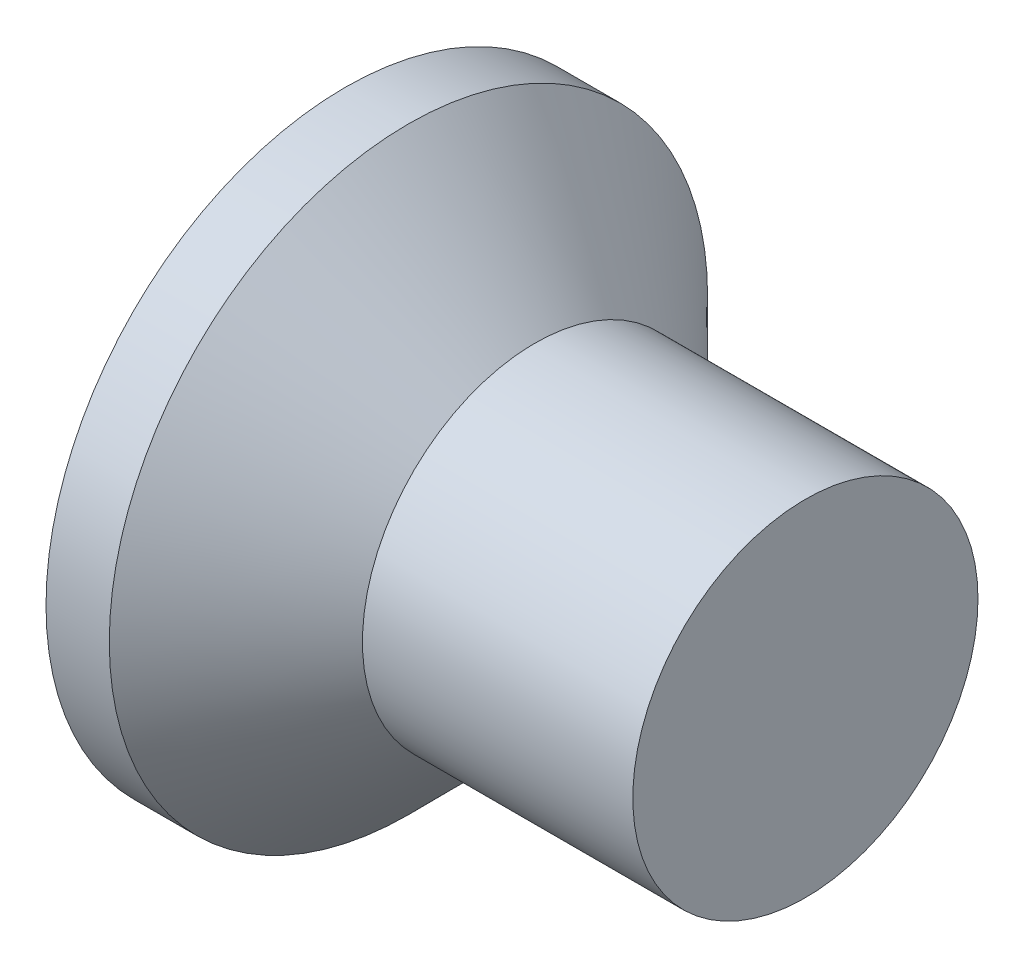
ISO-10303-21;
HEADER;
FILE_DESCRIPTION(('STEP AP214'),'2;1');
FILE_NAME('part.step','',(''),(''),'','','');
FILE_SCHEMA(('AUTOMOTIVE_DESIGN { 1 0 10303 214 1 1 1 1 }'));
ENDSEC;
DATA;
#1=APPLICATION_CONTEXT('core data for automotive mechanical design processes');
#2=APPLICATION_PROTOCOL_DEFINITION('international standard','automotive_design',2000,#1);
#3=PRODUCT_CONTEXT('',#1,'mechanical');
#4=PRODUCT('Part','Part','',(#3));
#5=PRODUCT_RELATED_PRODUCT_CATEGORY('part','',(#4));
#6=PRODUCT_DEFINITION_FORMATION('','',#4);
#7=PRODUCT_DEFINITION_CONTEXT('part definition',#1,'design');
#8=PRODUCT_DEFINITION('design','',#6,#7);
#9=PRODUCT_DEFINITION_SHAPE('','',#8);
#10=(LENGTH_UNIT() NAMED_UNIT(*) SI_UNIT(.MILLI.,.METRE.));
#11=(NAMED_UNIT(*) PLANE_ANGLE_UNIT() SI_UNIT($,.RADIAN.));
#12=(NAMED_UNIT(*) SI_UNIT($,.STERADIAN.) SOLID_ANGLE_UNIT());
#13=UNCERTAINTY_MEASURE_WITH_UNIT(LENGTH_MEASURE(1.E-05),#10,'distance_accuracy_value','');
#14=(GEOMETRIC_REPRESENTATION_CONTEXT(3) GLOBAL_UNCERTAINTY_ASSIGNED_CONTEXT((#13)) GLOBAL_UNIT_ASSIGNED_CONTEXT((#10,
#11,#12)) REPRESENTATION_CONTEXT('',''));
#15=CARTESIAN_POINT('',(0.,0.,0.));
#16=DIRECTION('',(0.,0.,1.));
#17=DIRECTION('',(1.,0.,0.));
#18=AXIS2_PLACEMENT_3D('',#15,#16,#17);
#19=CARTESIAN_POINT('',(0.,2.6,0.));
#20=DIRECTION('',(-1.,0.,0.));
#21=DIRECTION('',(0.,0.,1.));
#22=AXIS2_PLACEMENT_3D('',#19,#20,#21);
#23=PLANE('',#22);
#24=CARTESIAN_POINT('',(0.,0.,0.));
#25=DIRECTION('',(1.,0.,0.));
#26=DIRECTION('',(0.,0.,-1.));
#27=AXIS2_PLACEMENT_3D('',#24,#25,#26);
#28=CIRCLE('',#27,2.6);
#29=CARTESIAN_POINT('',(0.,0.,-2.6));
#30=VERTEX_POINT('',#29);
#31=EDGE_CURVE('E182',#30,#30,#28,.T.);
#32=ORIENTED_EDGE('',*,*,#31,.F.);
#33=EDGE_LOOP('',(#32));
#34=FACE_BOUND('',#33,.T.);
#35=DIRECTION('',(0.,1.,0.));
#36=VECTOR('',#35,1.);
#37=CARTESIAN_POINT('',(0.,-0.32,-0.32));
#38=LINE('',#37,#36);
#39=CARTESIAN_POINT('',(0.,-1.6,-0.32));
#40=VERTEX_POINT('',#39);
#41=CARTESIAN_POINT('',(0.,-0.62,-0.32));
#42=VERTEX_POINT('',#41);
#43=EDGE_CURVE('E308',#40,#42,#38,.T.);
#44=ORIENTED_EDGE('',*,*,#43,.T.);
#45=CARTESIAN_POINT('',(0.,-0.62,-0.62));
#46=DIRECTION('',(-1.,0.,0.));
#47=DIRECTION('',(0.,0.,1.));
#48=AXIS2_PLACEMENT_3D('',#45,#46,#47);
#49=CIRCLE('',#48,0.3);
#50=CARTESIAN_POINT('',(0.,-0.32,-0.62));
#51=VERTEX_POINT('',#50);
#52=EDGE_CURVE('E187',#42,#51,#49,.T.);
#53=ORIENTED_EDGE('',*,*,#52,.T.);
#54=DIRECTION('',(0.,0.,-1.));
#55=VECTOR('',#54,1.);
#56=CARTESIAN_POINT('',(0.,-0.32,-0.32));
#57=LINE('',#56,#55);
#58=CARTESIAN_POINT('',(0.,-0.32,-1.6));
#59=VERTEX_POINT('',#58);
#60=EDGE_CURVE('E310',#51,#59,#57,.T.);
#61=ORIENTED_EDGE('',*,*,#60,.T.);
#62=DIRECTION('',(0.,1.,0.));
#63=VECTOR('',#62,1.);
#64=CARTESIAN_POINT('',(0.,0.32,-1.6));
#65=LINE('',#64,#63);
#66=CARTESIAN_POINT('',(0.,0.32,-1.6));
#67=VERTEX_POINT('',#66);
#68=EDGE_CURVE('E312',#59,#67,#65,.T.);
#69=ORIENTED_EDGE('',*,*,#68,.T.);
#70=DIRECTION('',(0.,0.,1.));
#71=VECTOR('',#70,1.);
#72=CARTESIAN_POINT('',(0.,0.32,-0.32));
#73=LINE('',#72,#71);
#74=CARTESIAN_POINT('',(0.,0.32,-0.62));
#75=VERTEX_POINT('',#74);
#76=EDGE_CURVE('E315',#67,#75,#73,.T.);
#77=ORIENTED_EDGE('',*,*,#76,.T.);
#78=CARTESIAN_POINT('',(0.,0.62,-0.62));
#79=DIRECTION('',(-1.,0.,0.));
#80=DIRECTION('',(0.,0.,1.));
#81=AXIS2_PLACEMENT_3D('',#78,#79,#80);
#82=CIRCLE('',#81,0.3);
#83=CARTESIAN_POINT('',(0.,0.62,-0.32));
#84=VERTEX_POINT('',#83);
#85=EDGE_CURVE('E185',#75,#84,#82,.T.);
#86=ORIENTED_EDGE('',*,*,#85,.T.);
#87=DIRECTION('',(0.,1.,0.));
#88=VECTOR('',#87,1.);
#89=CARTESIAN_POINT('',(0.,0.32,-0.32));
#90=LINE('',#89,#88);
#91=CARTESIAN_POINT('',(0.,1.6,-0.32));
#92=VERTEX_POINT('',#91);
#93=EDGE_CURVE('E318',#84,#92,#90,.T.);
#94=ORIENTED_EDGE('',*,*,#93,.T.);
#95=DIRECTION('',(0.,0.,1.));
#96=VECTOR('',#95,1.);
#97=CARTESIAN_POINT('',(0.,1.6,-0.32));
#98=LINE('',#97,#96);
#99=CARTESIAN_POINT('',(0.,1.6,0.32));
#100=VERTEX_POINT('',#99);
#101=EDGE_CURVE('E320',#92,#100,#98,.T.);
#102=ORIENTED_EDGE('',*,*,#101,.T.);
#103=DIRECTION('',(0.,-1.,0.));
#104=VECTOR('',#103,1.);
#105=CARTESIAN_POINT('',(0.,0.32,0.32));
#106=LINE('',#105,#104);
#107=CARTESIAN_POINT('',(0.,0.62,0.32));
#108=VERTEX_POINT('',#107);
#109=EDGE_CURVE('E323',#100,#108,#106,.T.);
#110=ORIENTED_EDGE('',*,*,#109,.T.);
#111=CARTESIAN_POINT('',(0.,0.62,0.62));
#112=DIRECTION('',(-1.,0.,0.));
#113=DIRECTION('',(0.,0.,1.));
#114=AXIS2_PLACEMENT_3D('',#111,#112,#113);
#115=CIRCLE('',#114,0.3);
#116=CARTESIAN_POINT('',(0.,0.32,0.62));
#117=VERTEX_POINT('',#116);
#118=EDGE_CURVE('E150',#108,#117,#115,.T.);
#119=ORIENTED_EDGE('',*,*,#118,.T.);
#120=DIRECTION('',(0.,0.,1.));
#121=VECTOR('',#120,1.);
#122=CARTESIAN_POINT('',(0.,0.32,0.32));
#123=LINE('',#122,#121);
#124=CARTESIAN_POINT('',(0.,0.32,1.6));
#125=VERTEX_POINT('',#124);
#126=EDGE_CURVE('E144',#117,#125,#123,.T.);
#127=ORIENTED_EDGE('',*,*,#126,.T.);
#128=DIRECTION('',(0.,-1.,0.));
#129=VECTOR('',#128,1.);
#130=CARTESIAN_POINT('',(0.,0.32,1.6));
#131=LINE('',#130,#129);
#132=CARTESIAN_POINT('',(0.,-0.32,1.6));
#133=VERTEX_POINT('',#132);
#134=EDGE_CURVE('E148',#125,#133,#131,.T.);
#135=ORIENTED_EDGE('',*,*,#134,.T.);
#136=DIRECTION('',(0.,0.,-1.));
#137=VECTOR('',#136,1.);
#138=CARTESIAN_POINT('',(0.,-0.32,0.32));
#139=LINE('',#138,#137);
#140=CARTESIAN_POINT('',(0.,-0.32,0.62));
#141=VERTEX_POINT('',#140);
#142=EDGE_CURVE('E162',#133,#141,#139,.T.);
#143=ORIENTED_EDGE('',*,*,#142,.T.);
#144=CARTESIAN_POINT('',(0.,-0.62,0.62));
#145=DIRECTION('',(-1.,0.,0.));
#146=DIRECTION('',(0.,0.,1.));
#147=AXIS2_PLACEMENT_3D('',#144,#145,#146);
#148=CIRCLE('',#147,0.3);
#149=CARTESIAN_POINT('',(0.,-0.62,0.32));
#150=VERTEX_POINT('',#149);
#151=EDGE_CURVE('E181',#141,#150,#148,.T.);
#152=ORIENTED_EDGE('',*,*,#151,.T.);
#153=DIRECTION('',(0.,-1.,0.));
#154=VECTOR('',#153,1.);
#155=CARTESIAN_POINT('',(0.,-0.32,0.32));
#156=LINE('',#155,#154);
#157=CARTESIAN_POINT('',(0.,-1.6,0.319999999999999));
#158=VERTEX_POINT('',#157);
#159=EDGE_CURVE('E303',#150,#158,#156,.T.);
#160=ORIENTED_EDGE('',*,*,#159,.T.);
#161=DIRECTION('',(0.,0.,-1.));
#162=VECTOR('',#161,1.);
#163=CARTESIAN_POINT('',(0.,-1.6,-0.32));
#164=LINE('',#163,#162);
#165=EDGE_CURVE('E305',#158,#40,#164,.T.);
#166=ORIENTED_EDGE('',*,*,#165,.T.);
#167=EDGE_LOOP('',(#44,#53,#61,#69,#77,#86,#94,#102,#110,#119,#127,#135,#143,#152,#160,#166));
#168=FACE_BOUND('',#167,.T.);
#169=ADVANCED_FACE('F31',(#34,#168),#23,.T.);
#170=CARTESIAN_POINT('',(4.,1.5,0.));
#171=DIRECTION('',(1.,0.,0.));
#172=DIRECTION('',(0.,0.,-1.));
#173=AXIS2_PLACEMENT_3D('',#170,#171,#172);
#174=PLANE('',#173);
#175=CARTESIAN_POINT('',(4.,0.,0.));
#176=DIRECTION('',(1.,0.,0.));
#177=DIRECTION('',(0.,0.,-1.));
#178=AXIS2_PLACEMENT_3D('',#175,#176,#177);
#179=CIRCLE('',#178,1.5);
#180=CARTESIAN_POINT('',(4.,0.,-1.5));
#181=VERTEX_POINT('',#180);
#182=EDGE_CURVE('E168',#181,#181,#179,.T.);
#183=ORIENTED_EDGE('',*,*,#182,.T.);
#184=EDGE_LOOP('',(#183));
#185=FACE_BOUND('',#184,.T.);
#186=ADVANCED_FACE('F235',(#185),#174,.T.);
#187=CARTESIAN_POINT('',(4.51581291088132,0.,0.));
#188=DIRECTION('',(1.,0.,0.));
#189=DIRECTION('',(0.,0.,-1.));
#190=AXIS2_PLACEMENT_3D('',#187,#188,#189);
#191=CYLINDRICAL_SURFACE('',#190,2.6);
#192=ORIENTED_EDGE('',*,*,#31,.T.);
#193=EDGE_LOOP('',(#192));
#194=FACE_BOUND('',#193,.T.);
#195=CARTESIAN_POINT('',(0.550000000000004,0.,0.));
#196=DIRECTION('',(1.,0.,0.));
#197=DIRECTION('',(0.,0.,-1.));
#198=AXIS2_PLACEMENT_3D('',#195,#196,#197);
#199=CIRCLE('',#198,2.6);
#200=CARTESIAN_POINT('',(0.550000000000004,0.,-2.6));
#201=VERTEX_POINT('',#200);
#202=EDGE_CURVE('E327',#201,#201,#199,.T.);
#203=ORIENTED_EDGE('',*,*,#202,.F.);
#204=EDGE_LOOP('',(#203));
#205=FACE_BOUND('',#204,.T.);
#206=ADVANCED_FACE('F241',(#194,#205),#191,.T.);
#207=CARTESIAN_POINT('',(1.65,0.,0.));
#208=DIRECTION('',(-1.,0.,0.));
#209=DIRECTION('',(0.,0.,1.));
#210=AXIS2_PLACEMENT_3D('',#207,#208,#209);
#211=CONICAL_SURFACE('',#210,1.5,0.78539816339745);
#212=ORIENTED_EDGE('',*,*,#202,.T.);
#213=EDGE_LOOP('',(#212));
#214=FACE_BOUND('',#213,.T.);
#215=CARTESIAN_POINT('',(1.65,0.,0.));
#216=DIRECTION('',(1.,0.,0.));
#217=DIRECTION('',(0.,0.,-1.));
#218=AXIS2_PLACEMENT_3D('',#215,#216,#217);
#219=CIRCLE('',#218,1.5);
#220=CARTESIAN_POINT('',(1.65,0.,-1.5));
#221=VERTEX_POINT('',#220);
#222=EDGE_CURVE('E171',#221,#221,#219,.T.);
#223=ORIENTED_EDGE('',*,*,#222,.F.);
#224=EDGE_LOOP('',(#223));
#225=FACE_BOUND('',#224,.T.);
#226=ADVANCED_FACE('F363',(#214,#225),#211,.T.);
#227=CARTESIAN_POINT('',(4.51581291088132,0.,0.));
#228=DIRECTION('',(1.,0.,0.));
#229=DIRECTION('',(0.,0.,-1.));
#230=AXIS2_PLACEMENT_3D('',#227,#228,#229);
#231=CYLINDRICAL_SURFACE('',#230,1.5);
#232=ORIENTED_EDGE('',*,*,#222,.T.);
#233=EDGE_LOOP('',(#232));
#234=FACE_BOUND('',#233,.T.);
#235=ORIENTED_EDGE('',*,*,#182,.F.);
#236=EDGE_LOOP('',(#235));
#237=FACE_BOUND('',#236,.T.);
#238=ADVANCED_FACE('F361',(#234,#237),#231,.T.);
#239=CARTESIAN_POINT('',(0.825,0.32,0.32));
#240=DIRECTION('',(0.,-1.,0.));
#241=DIRECTION('',(0.,0.,-1.));
#242=AXIS2_PLACEMENT_3D('',#239,#240,#241);
#243=PLANE('',#242);
#244=ORIENTED_EDGE('',*,*,#126,.F.);
#245=DIRECTION('',(-1.,0.,0.));
#246=VECTOR('',#245,1.);
#247=CARTESIAN_POINT('',(0.825,0.32,0.62));
#248=LINE('',#247,#246);
#249=CARTESIAN_POINT('',(0.825,0.32,0.62));
#250=VERTEX_POINT('',#249);
#251=EDGE_CURVE('E199',#117,#250,#248,.F.);
#252=ORIENTED_EDGE('',*,*,#251,.T.);
#253=DIRECTION('',(0.,0.,1.));
#254=VECTOR('',#253,1.);
#255=CARTESIAN_POINT('',(0.825,0.32,0.32));
#256=LINE('',#255,#254);
#257=CARTESIAN_POINT('',(0.825,0.32,1.12368602791856));
#258=VERTEX_POINT('',#257);
#259=EDGE_CURVE('E166',#250,#258,#256,.T.);
#260=ORIENTED_EDGE('',*,*,#259,.T.);
#261=DIRECTION('',(-0.866025403784438,0.,0.500000000000001));
#262=VECTOR('',#261,1.);
#263=CARTESIAN_POINT('',(0.,0.32,1.6));
#264=LINE('',#263,#262);
#265=EDGE_CURVE('E158',#258,#125,#264,.T.);
#266=ORIENTED_EDGE('',*,*,#265,.T.);
#267=EDGE_LOOP('',(#244,#252,#260,#266));
#268=FACE_BOUND('',#267,.T.);
#269=ADVANCED_FACE('F164',(#268),#243,.T.);
#270=CARTESIAN_POINT('',(0.,0.32,1.6));
#271=DIRECTION('',(-0.500000000000001,0.,-0.866025403784438));
#272=DIRECTION('',(-0.866025403784438,0.,0.500000000000001));
#273=AXIS2_PLACEMENT_3D('',#270,#271,#272);
#274=PLANE('',#273);
#275=ORIENTED_EDGE('',*,*,#134,.F.);
#276=ORIENTED_EDGE('',*,*,#265,.F.);
#277=DIRECTION('',(0.,-1.,0.));
#278=VECTOR('',#277,1.);
#279=CARTESIAN_POINT('',(0.825,0.32,1.12368602791856));
#280=LINE('',#279,#278);
#281=CARTESIAN_POINT('',(0.825,-0.32,1.12368602791856));
#282=VERTEX_POINT('',#281);
#283=EDGE_CURVE('E177',#258,#282,#280,.T.);
#284=ORIENTED_EDGE('',*,*,#283,.T.);
#285=DIRECTION('',(-0.866025403784438,0.,0.500000000000001));
#286=VECTOR('',#285,1.);
#287=CARTESIAN_POINT('',(1.17300625842204,-0.32,0.922764520938917));
#288=LINE('',#287,#286);
#289=EDGE_CURVE('E160',#282,#133,#288,.T.);
#290=ORIENTED_EDGE('',*,*,#289,.T.);
#291=EDGE_LOOP('',(#275,#276,#284,#290));
#292=FACE_BOUND('',#291,.T.);
#293=ADVANCED_FACE('F157',(#292),#274,.T.);
#294=CARTESIAN_POINT('',(0.825,-0.32,0.32));
#295=DIRECTION('',(0.,1.,0.));
#296=DIRECTION('',(0.,0.,1.));
#297=AXIS2_PLACEMENT_3D('',#294,#295,#296);
#298=PLANE('',#297);
#299=DIRECTION('',(0.,0.,-1.));
#300=VECTOR('',#299,1.);
#301=CARTESIAN_POINT('',(0.825,-0.32,0.32));
#302=LINE('',#301,#300);
#303=CARTESIAN_POINT('',(0.825,-0.32,0.62));
#304=VERTEX_POINT('',#303);
#305=EDGE_CURVE('E349',#282,#304,#302,.T.);
#306=ORIENTED_EDGE('',*,*,#305,.T.);
#307=DIRECTION('',(-1.,0.,0.));
#308=VECTOR('',#307,1.);
#309=CARTESIAN_POINT('',(0.825,-0.32,0.62));
#310=LINE('',#309,#308);
#311=EDGE_CURVE('E201',#304,#141,#310,.T.);
#312=ORIENTED_EDGE('',*,*,#311,.T.);
#313=ORIENTED_EDGE('',*,*,#142,.F.);
#314=ORIENTED_EDGE('',*,*,#289,.F.);
#315=EDGE_LOOP('',(#306,#312,#313,#314));
#316=FACE_BOUND('',#315,.T.);
#317=ADVANCED_FACE('F255',(#316),#298,.T.);
#318=CARTESIAN_POINT('',(0.825,-0.32,0.32));
#319=DIRECTION('',(0.,0.,-1.));
#320=DIRECTION('',(0.,1.,0.));
#321=AXIS2_PLACEMENT_3D('',#318,#319,#320);
#322=PLANE('',#321);
#323=ORIENTED_EDGE('',*,*,#159,.F.);
#324=DIRECTION('',(-1.,0.,0.));
#325=VECTOR('',#324,1.);
#326=CARTESIAN_POINT('',(0.825,-0.62,0.32));
#327=LINE('',#326,#325);
#328=CARTESIAN_POINT('',(0.825,-0.62,0.32));
#329=VERTEX_POINT('',#328);
#330=EDGE_CURVE('E46',#150,#329,#327,.F.);
#331=ORIENTED_EDGE('',*,*,#330,.T.);
#332=DIRECTION('',(0.,-1.,0.));
#333=VECTOR('',#332,1.);
#334=CARTESIAN_POINT('',(0.825,-0.32,0.32));
#335=LINE('',#334,#333);
#336=CARTESIAN_POINT('',(0.825,-1.12368602791856,0.32));
#337=VERTEX_POINT('',#336);
#338=EDGE_CURVE('E292',#329,#337,#335,.T.);
#339=ORIENTED_EDGE('',*,*,#338,.T.);
#340=DIRECTION('',(-0.866025403784438,-0.500000000000001,0.));
#341=VECTOR('',#340,1.);
#342=CARTESIAN_POINT('',(0.,-1.6,0.319999999999999));
#343=LINE('',#342,#341);
#344=EDGE_CURVE('E173',#337,#158,#343,.T.);
#345=ORIENTED_EDGE('',*,*,#344,.T.);
#346=EDGE_LOOP('',(#323,#331,#339,#345));
#347=FACE_BOUND('',#346,.T.);
#348=ADVANCED_FACE('F260',(#347),#322,.T.);
#349=CARTESIAN_POINT('',(0.,-1.6,-0.32));
#350=DIRECTION('',(-0.500000000000001,0.866025403784438,0.));
#351=DIRECTION('',(-0.866025403784438,-0.500000000000001,0.));
#352=AXIS2_PLACEMENT_3D('',#349,#350,#351);
#353=PLANE('',#352);
#354=ORIENTED_EDGE('',*,*,#165,.F.);
#355=ORIENTED_EDGE('',*,*,#344,.F.);
#356=DIRECTION('',(0.,0.,-1.));
#357=VECTOR('',#356,1.);
#358=CARTESIAN_POINT('',(0.825,-1.12368602791856,-0.32));
#359=LINE('',#358,#357);
#360=CARTESIAN_POINT('',(0.825,-1.12368602791856,-0.32));
#361=VERTEX_POINT('',#360);
#362=EDGE_CURVE('E288',#337,#361,#359,.T.);
#363=ORIENTED_EDGE('',*,*,#362,.T.);
#364=DIRECTION('',(-0.866025403784438,-0.500000000000001,0.));
#365=VECTOR('',#364,1.);
#366=CARTESIAN_POINT('',(1.17300625842204,-0.922764520938917,-0.32));
#367=LINE('',#366,#365);
#368=EDGE_CURVE('E287',#361,#40,#367,.T.);
#369=ORIENTED_EDGE('',*,*,#368,.T.);
#370=EDGE_LOOP('',(#354,#355,#363,#369));
#371=FACE_BOUND('',#370,.T.);
#372=ADVANCED_FACE('F256',(#371),#353,.T.);
#373=CARTESIAN_POINT('',(0.825,-0.32,-0.32));
#374=DIRECTION('',(0.,0.,1.));
#375=DIRECTION('',(1.,0.,0.));
#376=AXIS2_PLACEMENT_3D('',#373,#374,#375);
#377=PLANE('',#376);
#378=DIRECTION('',(0.,1.,0.));
#379=VECTOR('',#378,1.);
#380=CARTESIAN_POINT('',(0.825,-0.32,-0.32));
#381=LINE('',#380,#379);
#382=CARTESIAN_POINT('',(0.825,-0.62,-0.32));
#383=VERTEX_POINT('',#382);
#384=EDGE_CURVE('E281',#361,#383,#381,.T.);
#385=ORIENTED_EDGE('',*,*,#384,.T.);
#386=DIRECTION('',(-1.,0.,0.));
#387=VECTOR('',#386,1.);
#388=CARTESIAN_POINT('',(0.825,-0.62,-0.32));
#389=LINE('',#388,#387);
#390=EDGE_CURVE('E178',#383,#42,#389,.T.);
#391=ORIENTED_EDGE('',*,*,#390,.T.);
#392=ORIENTED_EDGE('',*,*,#43,.F.);
#393=ORIENTED_EDGE('',*,*,#368,.F.);
#394=EDGE_LOOP('',(#385,#391,#392,#393));
#395=FACE_BOUND('',#394,.T.);
#396=ADVANCED_FACE('F259',(#395),#377,.T.);
#397=CARTESIAN_POINT('',(0.825,-0.32,-0.32));
#398=DIRECTION('',(0.,1.,0.));
#399=DIRECTION('',(0.,0.,1.));
#400=AXIS2_PLACEMENT_3D('',#397,#398,#399);
#401=PLANE('',#400);
#402=ORIENTED_EDGE('',*,*,#60,.F.);
#403=DIRECTION('',(-1.,0.,0.));
#404=VECTOR('',#403,1.);
#405=CARTESIAN_POINT('',(0.825,-0.32,-0.62));
#406=LINE('',#405,#404);
#407=CARTESIAN_POINT('',(0.825,-0.32,-0.62));
#408=VERTEX_POINT('',#407);
#409=EDGE_CURVE('E189',#51,#408,#406,.F.);
#410=ORIENTED_EDGE('',*,*,#409,.T.);
#411=DIRECTION('',(0.,0.,-1.));
#412=VECTOR('',#411,1.);
#413=CARTESIAN_POINT('',(0.825,-0.32,-0.32));
#414=LINE('',#413,#412);
#415=CARTESIAN_POINT('',(0.825,-0.32,-1.12368602791856));
#416=VERTEX_POINT('',#415);
#417=EDGE_CURVE('E283',#408,#416,#414,.T.);
#418=ORIENTED_EDGE('',*,*,#417,.T.);
#419=DIRECTION('',(-0.866025403784438,0.,-0.500000000000001));
#420=VECTOR('',#419,1.);
#421=CARTESIAN_POINT('',(0.,-0.32,-1.6));
#422=LINE('',#421,#420);
#423=EDGE_CURVE('E339',#416,#59,#422,.T.);
#424=ORIENTED_EDGE('',*,*,#423,.T.);
#425=EDGE_LOOP('',(#402,#410,#418,#424));
#426=FACE_BOUND('',#425,.T.);
#427=ADVANCED_FACE('F266',(#426),#401,.T.);
#428=CARTESIAN_POINT('',(0.,0.32,-1.6));
#429=DIRECTION('',(-0.500000000000001,0.,0.866025403784438));
#430=DIRECTION('',(0.866025403784438,0.,0.500000000000001));
#431=AXIS2_PLACEMENT_3D('',#428,#429,#430);
#432=PLANE('',#431);
#433=ORIENTED_EDGE('',*,*,#68,.F.);
#434=ORIENTED_EDGE('',*,*,#423,.F.);
#435=DIRECTION('',(0.,1.,0.));
#436=VECTOR('',#435,1.);
#437=CARTESIAN_POINT('',(0.825,0.32,-1.12368602791856));
#438=LINE('',#437,#436);
#439=CARTESIAN_POINT('',(0.825,0.32,-1.12368602791856));
#440=VERTEX_POINT('',#439);
#441=EDGE_CURVE('E290',#416,#440,#438,.T.);
#442=ORIENTED_EDGE('',*,*,#441,.T.);
#443=DIRECTION('',(-0.866025403784438,0.,-0.500000000000001));
#444=VECTOR('',#443,1.);
#445=CARTESIAN_POINT('',(1.17300625842204,0.32,-0.922764520938918));
#446=LINE('',#445,#444);
#447=EDGE_CURVE('E337',#440,#67,#446,.T.);
#448=ORIENTED_EDGE('',*,*,#447,.T.);
#449=EDGE_LOOP('',(#433,#434,#442,#448));
#450=FACE_BOUND('',#449,.T.);
#451=ADVANCED_FACE('F262',(#450),#432,.T.);
#452=CARTESIAN_POINT('',(0.825,0.32,-0.32));
#453=DIRECTION('',(0.,-1.,0.));
#454=DIRECTION('',(0.,0.,-1.));
#455=AXIS2_PLACEMENT_3D('',#452,#453,#454);
#456=PLANE('',#455);
#457=DIRECTION('',(0.,0.,1.));
#458=VECTOR('',#457,1.);
#459=CARTESIAN_POINT('',(0.825,0.32,-0.32));
#460=LINE('',#459,#458);
#461=CARTESIAN_POINT('',(0.825,0.32,-0.62));
#462=VERTEX_POINT('',#461);
#463=EDGE_CURVE('E297',#440,#462,#460,.T.);
#464=ORIENTED_EDGE('',*,*,#463,.T.);
#465=DIRECTION('',(-1.,0.,0.));
#466=VECTOR('',#465,1.);
#467=CARTESIAN_POINT('',(0.825,0.32,-0.62));
#468=LINE('',#467,#466);
#469=EDGE_CURVE('E191',#462,#75,#468,.T.);
#470=ORIENTED_EDGE('',*,*,#469,.T.);
#471=ORIENTED_EDGE('',*,*,#76,.F.);
#472=ORIENTED_EDGE('',*,*,#447,.F.);
#473=EDGE_LOOP('',(#464,#470,#471,#472));
#474=FACE_BOUND('',#473,.T.);
#475=ADVANCED_FACE('F265',(#474),#456,.T.);
#476=CARTESIAN_POINT('',(0.825,0.32,-0.32));
#477=DIRECTION('',(0.,0.,1.));
#478=DIRECTION('',(1.,0.,0.));
#479=AXIS2_PLACEMENT_3D('',#476,#477,#478);
#480=PLANE('',#479);
#481=ORIENTED_EDGE('',*,*,#93,.F.);
#482=DIRECTION('',(-1.,0.,0.));
#483=VECTOR('',#482,1.);
#484=CARTESIAN_POINT('',(0.825,0.62,-0.32));
#485=LINE('',#484,#483);
#486=CARTESIAN_POINT('',(0.825,0.62,-0.32));
#487=VERTEX_POINT('',#486);
#488=EDGE_CURVE('E194',#84,#487,#485,.F.);
#489=ORIENTED_EDGE('',*,*,#488,.T.);
#490=DIRECTION('',(0.,1.,0.));
#491=VECTOR('',#490,1.);
#492=CARTESIAN_POINT('',(0.825,0.32,-0.32));
#493=LINE('',#492,#491);
#494=CARTESIAN_POINT('',(0.825,1.12368602791856,-0.32));
#495=VERTEX_POINT('',#494);
#496=EDGE_CURVE('E300',#487,#495,#493,.T.);
#497=ORIENTED_EDGE('',*,*,#496,.T.);
#498=DIRECTION('',(-0.866025403784438,0.500000000000001,0.));
#499=VECTOR('',#498,1.);
#500=CARTESIAN_POINT('',(0.,1.6,-0.32));
#501=LINE('',#500,#499);
#502=EDGE_CURVE('E333',#495,#92,#501,.T.);
#503=ORIENTED_EDGE('',*,*,#502,.T.);
#504=EDGE_LOOP('',(#481,#489,#497,#503));
#505=FACE_BOUND('',#504,.T.);
#506=ADVANCED_FACE('F251',(#505),#480,.T.);
#507=CARTESIAN_POINT('',(0.,1.6,-0.32));
#508=DIRECTION('',(-0.500000000000001,-0.866025403784438,0.));
#509=DIRECTION('',(0.866025403784438,-0.500000000000001,0.));
#510=AXIS2_PLACEMENT_3D('',#507,#508,#509);
#511=PLANE('',#510);
#512=ORIENTED_EDGE('',*,*,#101,.F.);
#513=ORIENTED_EDGE('',*,*,#502,.F.);
#514=DIRECTION('',(0.,0.,1.));
#515=VECTOR('',#514,1.);
#516=CARTESIAN_POINT('',(0.825,1.12368602791856,-0.32));
#517=LINE('',#516,#515);
#518=CARTESIAN_POINT('',(0.825,1.12368602791856,0.32));
#519=VERTEX_POINT('',#518);
#520=EDGE_CURVE('E221',#495,#519,#517,.T.);
#521=ORIENTED_EDGE('',*,*,#520,.T.);
#522=DIRECTION('',(-0.866025403784438,0.500000000000001,0.));
#523=VECTOR('',#522,1.);
#524=CARTESIAN_POINT('',(1.17300625842204,0.922764520938917,0.32));
#525=LINE('',#524,#523);
#526=EDGE_CURVE('E220',#519,#100,#525,.T.);
#527=ORIENTED_EDGE('',*,*,#526,.T.);
#528=EDGE_LOOP('',(#512,#513,#521,#527));
#529=FACE_BOUND('',#528,.T.);
#530=ADVANCED_FACE('F248',(#529),#511,.T.);
#531=CARTESIAN_POINT('',(0.825,0.32,0.32));
#532=DIRECTION('',(0.,0.,-1.));
#533=DIRECTION('',(0.,1.,0.));
#534=AXIS2_PLACEMENT_3D('',#531,#532,#533);
#535=PLANE('',#534);
#536=DIRECTION('',(0.,-1.,0.));
#537=VECTOR('',#536,1.);
#538=CARTESIAN_POINT('',(0.825,0.32,0.32));
#539=LINE('',#538,#537);
#540=CARTESIAN_POINT('',(0.825,0.62,0.32));
#541=VERTEX_POINT('',#540);
#542=EDGE_CURVE('E213',#519,#541,#539,.T.);
#543=ORIENTED_EDGE('',*,*,#542,.T.);
#544=DIRECTION('',(-1.,0.,0.));
#545=VECTOR('',#544,1.);
#546=CARTESIAN_POINT('',(0.825,0.62,0.32));
#547=LINE('',#546,#545);
#548=EDGE_CURVE('E196',#541,#108,#547,.T.);
#549=ORIENTED_EDGE('',*,*,#548,.T.);
#550=ORIENTED_EDGE('',*,*,#109,.F.);
#551=ORIENTED_EDGE('',*,*,#526,.F.);
#552=EDGE_LOOP('',(#543,#549,#550,#551));
#553=FACE_BOUND('',#552,.T.);
#554=ADVANCED_FACE('F218',(#553),#535,.T.);
#555=CARTESIAN_POINT('',(0.825,0.32,0.32));
#556=DIRECTION('',(1.,0.,0.));
#557=DIRECTION('',(0.,0.,-1.));
#558=AXIS2_PLACEMENT_3D('',#555,#556,#557);
#559=PLANE('',#558);
#560=ORIENTED_EDGE('',*,*,#259,.F.);
#561=CARTESIAN_POINT('',(0.825,0.62,0.62));
#562=DIRECTION('',(1.,0.,0.));
#563=DIRECTION('',(0.,0.,-1.));
#564=AXIS2_PLACEMENT_3D('',#561,#562,#563);
#565=CIRCLE('',#564,0.3);
#566=EDGE_CURVE('E39',#250,#541,#565,.T.);
#567=ORIENTED_EDGE('',*,*,#566,.T.);
#568=ORIENTED_EDGE('',*,*,#542,.F.);
#569=ORIENTED_EDGE('',*,*,#520,.F.);
#570=ORIENTED_EDGE('',*,*,#496,.F.);
#571=CARTESIAN_POINT('',(0.825,0.62,-0.62));
#572=DIRECTION('',(1.,0.,0.));
#573=DIRECTION('',(0.,0.,-1.));
#574=AXIS2_PLACEMENT_3D('',#571,#572,#573);
#575=CIRCLE('',#574,0.3);
#576=EDGE_CURVE('E207',#487,#462,#575,.T.);
#577=ORIENTED_EDGE('',*,*,#576,.T.);
#578=ORIENTED_EDGE('',*,*,#463,.F.);
#579=ORIENTED_EDGE('',*,*,#441,.F.);
#580=ORIENTED_EDGE('',*,*,#417,.F.);
#581=CARTESIAN_POINT('',(0.825,-0.62,-0.62));
#582=DIRECTION('',(1.,0.,0.));
#583=DIRECTION('',(0.,0.,-1.));
#584=AXIS2_PLACEMENT_3D('',#581,#582,#583);
#585=CIRCLE('',#584,0.3);
#586=EDGE_CURVE('E205',#408,#383,#585,.T.);
#587=ORIENTED_EDGE('',*,*,#586,.T.);
#588=ORIENTED_EDGE('',*,*,#384,.F.);
#589=ORIENTED_EDGE('',*,*,#362,.F.);
#590=ORIENTED_EDGE('',*,*,#338,.F.);
#591=CARTESIAN_POINT('',(0.825,-0.62,0.62));
#592=DIRECTION('',(1.,0.,0.));
#593=DIRECTION('',(0.,0.,-1.));
#594=AXIS2_PLACEMENT_3D('',#591,#592,#593);
#595=CIRCLE('',#594,0.3);
#596=EDGE_CURVE('E11',#329,#304,#595,.T.);
#597=ORIENTED_EDGE('',*,*,#596,.T.);
#598=ORIENTED_EDGE('',*,*,#305,.F.);
#599=ORIENTED_EDGE('',*,*,#283,.F.);
#600=EDGE_LOOP('',(#560,#567,#568,#569,#570,#577,#578,#579,#580,#587,#588,#589,#590,#597,#598,#599));
#601=FACE_BOUND('',#600,.T.);
#602=ADVANCED_FACE('F211',(#601),#559,.F.);
#603=CARTESIAN_POINT('',(0.825,-0.62,-0.62));
#604=DIRECTION('',(-1.,0.,0.));
#605=DIRECTION('',(0.,0.,1.));
#606=AXIS2_PLACEMENT_3D('',#603,#604,#605);
#607=CYLINDRICAL_SURFACE('',#606,0.3);
#608=ORIENTED_EDGE('',*,*,#586,.F.);
#609=ORIENTED_EDGE('',*,*,#409,.F.);
#610=ORIENTED_EDGE('',*,*,#52,.F.);
#611=ORIENTED_EDGE('',*,*,#390,.F.);
#612=EDGE_LOOP('',(#608,#609,#610,#611));
#613=FACE_BOUND('',#612,.T.);
#614=ADVANCED_FACE('F231',(#613),#607,.T.);
#615=CARTESIAN_POINT('',(0.825,0.62,-0.62));
#616=DIRECTION('',(-1.,0.,0.));
#617=DIRECTION('',(0.,0.,1.));
#618=AXIS2_PLACEMENT_3D('',#615,#616,#617);
#619=CYLINDRICAL_SURFACE('',#618,0.3);
#620=ORIENTED_EDGE('',*,*,#576,.F.);
#621=ORIENTED_EDGE('',*,*,#488,.F.);
#622=ORIENTED_EDGE('',*,*,#85,.F.);
#623=ORIENTED_EDGE('',*,*,#469,.F.);
#624=EDGE_LOOP('',(#620,#621,#622,#623));
#625=FACE_BOUND('',#624,.T.);
#626=ADVANCED_FACE('F225',(#625),#619,.T.);
#627=CARTESIAN_POINT('',(0.825,0.62,0.62));
#628=DIRECTION('',(-1.,0.,0.));
#629=DIRECTION('',(0.,0.,1.));
#630=AXIS2_PLACEMENT_3D('',#627,#628,#629);
#631=CYLINDRICAL_SURFACE('',#630,0.3);
#632=ORIENTED_EDGE('',*,*,#566,.F.);
#633=ORIENTED_EDGE('',*,*,#251,.F.);
#634=ORIENTED_EDGE('',*,*,#118,.F.);
#635=ORIENTED_EDGE('',*,*,#548,.F.);
#636=EDGE_LOOP('',(#632,#633,#634,#635));
#637=FACE_BOUND('',#636,.T.);
#638=ADVANCED_FACE('F223',(#637),#631,.T.);
#639=CARTESIAN_POINT('',(0.825,-0.62,0.62));
#640=DIRECTION('',(-1.,0.,0.));
#641=DIRECTION('',(0.,0.,1.));
#642=AXIS2_PLACEMENT_3D('',#639,#640,#641);
#643=CYLINDRICAL_SURFACE('',#642,0.3);
#644=ORIENTED_EDGE('',*,*,#596,.F.);
#645=ORIENTED_EDGE('',*,*,#330,.F.);
#646=ORIENTED_EDGE('',*,*,#151,.F.);
#647=ORIENTED_EDGE('',*,*,#311,.F.);
#648=EDGE_LOOP('',(#644,#645,#646,#647));
#649=FACE_BOUND('',#648,.T.);
#650=ADVANCED_FACE('F33',(#649),#643,.T.);
#651=CLOSED_SHELL('',(#169,#186,#206,#226,#238,#269,#293,#317,#348,#372,#396,#427,#451,#475,
#506,#530,#554,#602,#614,#626,#638,#650));
#652=MANIFOLD_SOLID_BREP('B2',#651);
#653=ADVANCED_BREP_SHAPE_REPRESENTATION('',(#18,#652),#14);
#654=SHAPE_DEFINITION_REPRESENTATION(#9,#653);
ENDSEC;
END-ISO-10303-21;
